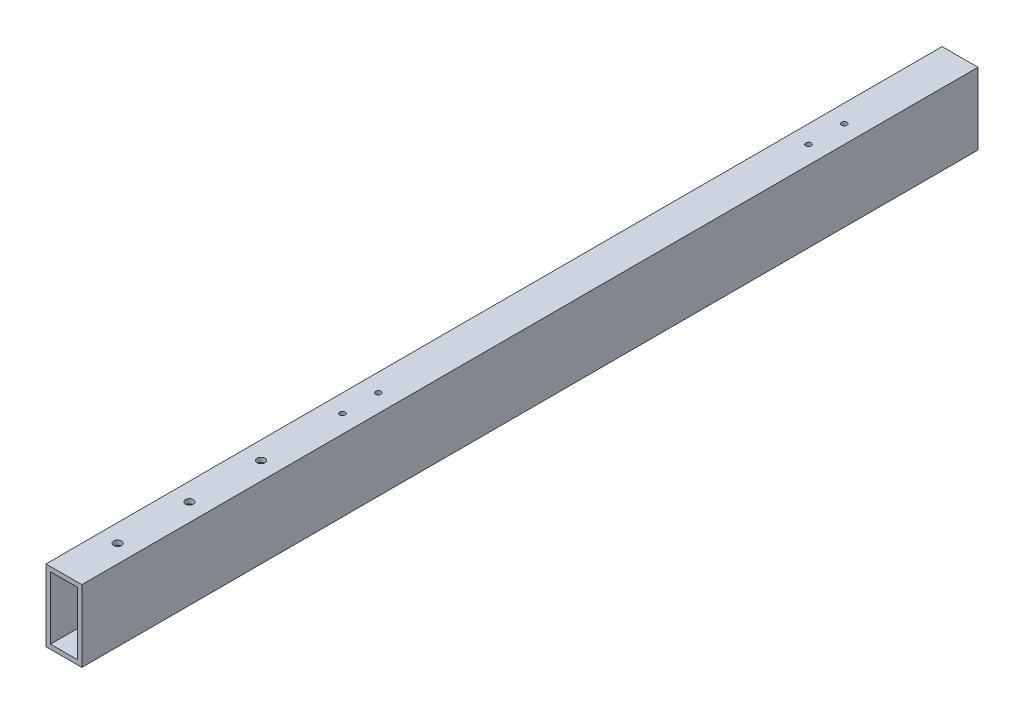
ISO-10303-21;
HEADER;
FILE_DESCRIPTION(('STEP AP214'),'2;1');
FILE_NAME('part.step','',(''),(''),'','','');
FILE_SCHEMA(('AUTOMOTIVE_DESIGN { 1 0 10303 214 1 1 1 1 }'));
ENDSEC;
DATA;
#1=APPLICATION_CONTEXT('core data for automotive mechanical design processes');
#2=APPLICATION_PROTOCOL_DEFINITION('international standard','automotive_design',2000,#1);
#3=PRODUCT_CONTEXT('',#1,'mechanical');
#4=PRODUCT('Part','Part','',(#3));
#5=PRODUCT_RELATED_PRODUCT_CATEGORY('part','',(#4));
#6=PRODUCT_DEFINITION_FORMATION('','',#4);
#7=PRODUCT_DEFINITION_CONTEXT('part definition',#1,'design');
#8=PRODUCT_DEFINITION('design','',#6,#7);
#9=PRODUCT_DEFINITION_SHAPE('','',#8);
#10=(LENGTH_UNIT() NAMED_UNIT(*) SI_UNIT(.MILLI.,.METRE.));
#11=(NAMED_UNIT(*) PLANE_ANGLE_UNIT() SI_UNIT($,.RADIAN.));
#12=(NAMED_UNIT(*) SI_UNIT($,.STERADIAN.) SOLID_ANGLE_UNIT());
#13=UNCERTAINTY_MEASURE_WITH_UNIT(LENGTH_MEASURE(1.E-05),#10,'distance_accuracy_value','');
#14=(GEOMETRIC_REPRESENTATION_CONTEXT(3) GLOBAL_UNCERTAINTY_ASSIGNED_CONTEXT((#13)) GLOBAL_UNIT_ASSIGNED_CONTEXT((#10,
#11,#12)) REPRESENTATION_CONTEXT('',''));
#15=CARTESIAN_POINT('',(0.,0.,0.));
#16=DIRECTION('',(0.,0.,1.));
#17=DIRECTION('',(1.,0.,0.));
#18=AXIS2_PLACEMENT_3D('',#15,#16,#17);
#19=CARTESIAN_POINT('',(0.,0.,317.5));
#20=DIRECTION('',(0.,0.,1.));
#21=DIRECTION('',(1.,0.,0.));
#22=AXIS2_PLACEMENT_3D('',#19,#20,#21);
#23=PLANE('',#22);
#24=DIRECTION('',(0.,1.,0.));
#25=VECTOR('',#24,1.);
#26=CARTESIAN_POINT('',(12.7,25.4,317.5));
#27=LINE('',#26,#25);
#28=CARTESIAN_POINT('',(12.7,-25.4,317.5));
#29=VERTEX_POINT('',#28);
#30=CARTESIAN_POINT('',(12.7,25.4,317.5));
#31=VERTEX_POINT('',#30);
#32=EDGE_CURVE('E140',#29,#31,#27,.T.);
#33=ORIENTED_EDGE('',*,*,#32,.T.);
#34=DIRECTION('',(-1.,0.,0.));
#35=VECTOR('',#34,1.);
#36=CARTESIAN_POINT('',(-12.7,25.4,317.5));
#37=LINE('',#36,#35);
#38=CARTESIAN_POINT('',(-12.7,25.4,317.5));
#39=VERTEX_POINT('',#38);
#40=EDGE_CURVE('E143',#31,#39,#37,.T.);
#41=ORIENTED_EDGE('',*,*,#40,.T.);
#42=DIRECTION('',(0.,-1.,0.));
#43=VECTOR('',#42,1.);
#44=CARTESIAN_POINT('',(-12.7,25.4,317.5));
#45=LINE('',#44,#43);
#46=CARTESIAN_POINT('',(-12.7,-25.4,317.5));
#47=VERTEX_POINT('',#46);
#48=EDGE_CURVE('E146',#39,#47,#45,.T.);
#49=ORIENTED_EDGE('',*,*,#48,.T.);
#50=DIRECTION('',(1.,0.,0.));
#51=VECTOR('',#50,1.);
#52=CARTESIAN_POINT('',(-12.7,-25.4,317.5));
#53=LINE('',#52,#51);
#54=EDGE_CURVE('E148',#47,#29,#53,.T.);
#55=ORIENTED_EDGE('',*,*,#54,.T.);
#56=EDGE_LOOP('',(#33,#41,#49,#55));
#57=FACE_BOUND('',#56,.T.);
#58=DIRECTION('',(1.,0.,0.));
#59=VECTOR('',#58,1.);
#60=CARTESIAN_POINT('',(-9.525,-22.225,317.5));
#61=LINE('',#60,#59);
#62=CARTESIAN_POINT('',(-9.525,-22.225,317.5));
#63=VERTEX_POINT('',#62);
#64=CARTESIAN_POINT('',(9.52500000000001,-22.225,317.5));
#65=VERTEX_POINT('',#64);
#66=EDGE_CURVE('E110',#63,#65,#61,.T.);
#67=ORIENTED_EDGE('',*,*,#66,.F.);
#68=DIRECTION('',(0.,-1.,0.));
#69=VECTOR('',#68,1.);
#70=CARTESIAN_POINT('',(-9.525,22.225,317.5));
#71=LINE('',#70,#69);
#72=CARTESIAN_POINT('',(-9.525,22.225,317.5));
#73=VERTEX_POINT('',#72);
#74=EDGE_CURVE('E102',#73,#63,#71,.T.);
#75=ORIENTED_EDGE('',*,*,#74,.F.);
#76=DIRECTION('',(-1.,0.,0.));
#77=VECTOR('',#76,1.);
#78=CARTESIAN_POINT('',(-9.525,22.225,317.5));
#79=LINE('',#78,#77);
#80=CARTESIAN_POINT('',(9.525,22.225,317.5));
#81=VERTEX_POINT('',#80);
#82=EDGE_CURVE('E124',#81,#73,#79,.T.);
#83=ORIENTED_EDGE('',*,*,#82,.F.);
#84=DIRECTION('',(0.,1.,0.));
#85=VECTOR('',#84,1.);
#86=CARTESIAN_POINT('',(9.525,22.225,317.5));
#87=LINE('',#86,#85);
#88=EDGE_CURVE('E122',#65,#81,#87,.T.);
#89=ORIENTED_EDGE('',*,*,#88,.F.);
#90=EDGE_LOOP('',(#67,#75,#83,#89));
#91=FACE_BOUND('',#90,.T.);
#92=ADVANCED_FACE('F35',(#57,#91),#23,.T.);
#93=CARTESIAN_POINT('',(0.,0.,-317.5));
#94=DIRECTION('',(0.,0.,1.));
#95=DIRECTION('',(1.,0.,0.));
#96=AXIS2_PLACEMENT_3D('',#93,#94,#95);
#97=PLANE('',#96);
#98=DIRECTION('',(0.,1.,0.));
#99=VECTOR('',#98,1.);
#100=CARTESIAN_POINT('',(12.7,25.4,-317.5));
#101=LINE('',#100,#99);
#102=CARTESIAN_POINT('',(12.7,-25.4,-317.5));
#103=VERTEX_POINT('',#102);
#104=CARTESIAN_POINT('',(12.7,25.4,-317.5));
#105=VERTEX_POINT('',#104);
#106=EDGE_CURVE('E118',#103,#105,#101,.T.);
#107=ORIENTED_EDGE('',*,*,#106,.F.);
#108=DIRECTION('',(1.,0.,0.));
#109=VECTOR('',#108,1.);
#110=CARTESIAN_POINT('',(-12.7,-25.4,-317.5));
#111=LINE('',#110,#109);
#112=CARTESIAN_POINT('',(-12.7,-25.4,-317.5));
#113=VERTEX_POINT('',#112);
#114=EDGE_CURVE('E144',#113,#103,#111,.T.);
#115=ORIENTED_EDGE('',*,*,#114,.F.);
#116=DIRECTION('',(0.,-1.,0.));
#117=VECTOR('',#116,1.);
#118=CARTESIAN_POINT('',(-12.7,25.4,-317.5));
#119=LINE('',#118,#117);
#120=CARTESIAN_POINT('',(-12.7,25.4,-317.5));
#121=VERTEX_POINT('',#120);
#122=EDGE_CURVE('E155',#121,#113,#119,.T.);
#123=ORIENTED_EDGE('',*,*,#122,.F.);
#124=DIRECTION('',(-1.,0.,0.));
#125=VECTOR('',#124,1.);
#126=CARTESIAN_POINT('',(-12.7,25.4,-317.5));
#127=LINE('',#126,#125);
#128=EDGE_CURVE('E153',#105,#121,#127,.T.);
#129=ORIENTED_EDGE('',*,*,#128,.F.);
#130=EDGE_LOOP('',(#107,#115,#123,#129));
#131=FACE_BOUND('',#130,.T.);
#132=DIRECTION('',(0.,-1.,0.));
#133=VECTOR('',#132,1.);
#134=CARTESIAN_POINT('',(-9.525,22.225,-317.5));
#135=LINE('',#134,#133);
#136=CARTESIAN_POINT('',(-9.525,22.225,-317.5));
#137=VERTEX_POINT('',#136);
#138=CARTESIAN_POINT('',(-9.525,-22.225,-317.5));
#139=VERTEX_POINT('',#138);
#140=EDGE_CURVE('E60',#137,#139,#135,.T.);
#141=ORIENTED_EDGE('',*,*,#140,.T.);
#142=DIRECTION('',(1.,0.,0.));
#143=VECTOR('',#142,1.);
#144=CARTESIAN_POINT('',(-9.525,-22.225,-317.5));
#145=LINE('',#144,#143);
#146=CARTESIAN_POINT('',(9.52500000000001,-22.225,-317.5));
#147=VERTEX_POINT('',#146);
#148=EDGE_CURVE('E117',#139,#147,#145,.T.);
#149=ORIENTED_EDGE('',*,*,#148,.T.);
#150=DIRECTION('',(0.,1.,0.));
#151=VECTOR('',#150,1.);
#152=CARTESIAN_POINT('',(9.525,22.225,-317.5));
#153=LINE('',#152,#151);
#154=CARTESIAN_POINT('',(9.525,22.225,-317.5));
#155=VERTEX_POINT('',#154);
#156=EDGE_CURVE('E132',#147,#155,#153,.T.);
#157=ORIENTED_EDGE('',*,*,#156,.T.);
#158=DIRECTION('',(-1.,0.,0.));
#159=VECTOR('',#158,1.);
#160=CARTESIAN_POINT('',(-9.525,22.225,-317.5));
#161=LINE('',#160,#159);
#162=EDGE_CURVE('E111',#155,#137,#161,.T.);
#163=ORIENTED_EDGE('',*,*,#162,.T.);
#164=EDGE_LOOP('',(#141,#149,#157,#163));
#165=FACE_BOUND('',#164,.T.);
#166=ADVANCED_FACE('F255',(#131,#165),#97,.F.);
#167=CARTESIAN_POINT('',(12.7,25.4,317.5));
#168=DIRECTION('',(-1.,0.,0.));
#169=DIRECTION('',(0.,-1.,0.));
#170=AXIS2_PLACEMENT_3D('',#167,#168,#169);
#171=PLANE('',#170);
#172=ORIENTED_EDGE('',*,*,#106,.T.);
#173=DIRECTION('',(0.,0.,-1.));
#174=VECTOR('',#173,1.);
#175=CARTESIAN_POINT('',(12.7,25.4,317.5));
#176=LINE('',#175,#174);
#177=EDGE_CURVE('E11',#31,#105,#176,.T.);
#178=ORIENTED_EDGE('',*,*,#177,.F.);
#179=ORIENTED_EDGE('',*,*,#32,.F.);
#180=DIRECTION('',(0.,0.,-1.));
#181=VECTOR('',#180,1.);
#182=CARTESIAN_POINT('',(12.7,-25.4,317.5));
#183=LINE('',#182,#181);
#184=EDGE_CURVE('E150',#29,#103,#183,.T.);
#185=ORIENTED_EDGE('',*,*,#184,.T.);
#186=EDGE_LOOP('',(#172,#178,#179,#185));
#187=FACE_BOUND('',#186,.T.);
#188=ADVANCED_FACE('F37',(#187),#171,.F.);
#189=CARTESIAN_POINT('',(-12.7,25.4,317.5));
#190=DIRECTION('',(0.,-1.,0.));
#191=DIRECTION('',(0.,0.,-1.));
#192=AXIS2_PLACEMENT_3D('',#189,#190,#191);
#193=PLANE('',#192);
#194=CARTESIAN_POINT('',(2.04003480774873E-12,25.4,279.399917535532));
#195=DIRECTION('',(0.,1.,0.));
#196=DIRECTION('',(0.,0.,1.));
#197=AXIS2_PLACEMENT_3D('',#194,#195,#196);
#198=CIRCLE('',#197,2.80670000004883);
#199=CARTESIAN_POINT('',(2.04003480774873E-12,25.4,282.206617535581));
#200=VERTEX_POINT('',#199);
#201=EDGE_CURVE('E280',#200,#200,#198,.T.);
#202=ORIENTED_EDGE('',*,*,#201,.F.);
#203=EDGE_LOOP('',(#202));
#204=FACE_BOUND('',#203,.T.);
#205=CARTESIAN_POINT('',(2.02615701994091E-12,25.4,228.599917535532));
#206=DIRECTION('',(0.,1.,0.));
#207=DIRECTION('',(0.,0.,1.));
#208=AXIS2_PLACEMENT_3D('',#205,#206,#207);
#209=CIRCLE('',#208,2.80670000004884);
#210=CARTESIAN_POINT('',(2.02615701994091E-12,25.4,231.406617535581));
#211=VERTEX_POINT('',#210);
#212=EDGE_CURVE('E200',#211,#211,#209,.T.);
#213=ORIENTED_EDGE('',*,*,#212,.F.);
#214=EDGE_LOOP('',(#213));
#215=FACE_BOUND('',#214,.T.);
#216=CARTESIAN_POINT('',(9.06774655362597E-11,25.4,177.799917535655));
#217=DIRECTION('',(0.,1.,0.));
#218=DIRECTION('',(0.,0.,1.));
#219=AXIS2_PLACEMENT_3D('',#216,#217,#218);
#220=CIRCLE('',#219,2.8067);
#221=CARTESIAN_POINT('',(9.06774655362597E-11,25.4,180.606617535655));
#222=VERTEX_POINT('',#221);
#223=EDGE_CURVE('E287',#222,#222,#220,.T.);
#224=ORIENTED_EDGE('',*,*,#223,.F.);
#225=EDGE_LOOP('',(#224));
#226=FACE_BOUND('',#225,.T.);
#227=CARTESIAN_POINT('',(0.,25.4,-210.08594));
#228=DIRECTION('',(0.,1.,0.));
#229=DIRECTION('',(0.,0.,1.));
#230=AXIS2_PLACEMENT_3D('',#227,#228,#229);
#231=CIRCLE('',#230,1.905);
#232=CARTESIAN_POINT('',(0.,25.4,-208.18094));
#233=VERTEX_POINT('',#232);
#234=EDGE_CURVE('E206',#233,#233,#231,.T.);
#235=ORIENTED_EDGE('',*,*,#234,.F.);
#236=EDGE_LOOP('',(#235));
#237=FACE_BOUND('',#236,.T.);
#238=CARTESIAN_POINT('',(0.,25.4,-235.48594));
#239=DIRECTION('',(0.,1.,0.));
#240=DIRECTION('',(0.,0.,1.));
#241=AXIS2_PLACEMENT_3D('',#238,#239,#240);
#242=CIRCLE('',#241,1.905);
#243=CARTESIAN_POINT('',(0.,25.4,-233.58094));
#244=VERTEX_POINT('',#243);
#245=EDGE_CURVE('E213',#244,#244,#242,.T.);
#246=ORIENTED_EDGE('',*,*,#245,.F.);
#247=EDGE_LOOP('',(#246));
#248=FACE_BOUND('',#247,.T.);
#249=CARTESIAN_POINT('',(0.,25.4,94.7166));
#250=DIRECTION('',(0.,1.,0.));
#251=DIRECTION('',(0.,0.,1.));
#252=AXIS2_PLACEMENT_3D('',#249,#250,#251);
#253=CIRCLE('',#252,1.905);
#254=CARTESIAN_POINT('',(0.,25.4,96.6216));
#255=VERTEX_POINT('',#254);
#256=EDGE_CURVE('E220',#255,#255,#253,.T.);
#257=ORIENTED_EDGE('',*,*,#256,.F.);
#258=EDGE_LOOP('',(#257));
#259=FACE_BOUND('',#258,.T.);
#260=CARTESIAN_POINT('',(0.,25.4,120.1166));
#261=DIRECTION('',(0.,1.,0.));
#262=DIRECTION('',(0.,0.,1.));
#263=AXIS2_PLACEMENT_3D('',#260,#261,#262);
#264=CIRCLE('',#263,1.905);
#265=CARTESIAN_POINT('',(0.,25.4,122.0216));
#266=VERTEX_POINT('',#265);
#267=EDGE_CURVE('E227',#266,#266,#264,.T.);
#268=ORIENTED_EDGE('',*,*,#267,.F.);
#269=EDGE_LOOP('',(#268));
#270=FACE_BOUND('',#269,.T.);
#271=ORIENTED_EDGE('',*,*,#128,.T.);
#272=DIRECTION('',(0.,0.,-1.));
#273=VECTOR('',#272,1.);
#274=CARTESIAN_POINT('',(-12.7,25.4,317.5));
#275=LINE('',#274,#273);
#276=EDGE_CURVE('E44',#39,#121,#275,.T.);
#277=ORIENTED_EDGE('',*,*,#276,.F.);
#278=ORIENTED_EDGE('',*,*,#40,.F.);
#279=ORIENTED_EDGE('',*,*,#177,.T.);
#280=EDGE_LOOP('',(#271,#277,#278,#279));
#281=FACE_BOUND('',#280,.T.);
#282=ADVANCED_FACE('F268',(#204,#215,#226,#237,#248,#259,#270,#281),#193,.F.);
#283=CARTESIAN_POINT('',(-12.7,25.4,317.5));
#284=DIRECTION('',(1.,0.,0.));
#285=DIRECTION('',(0.,1.,0.));
#286=AXIS2_PLACEMENT_3D('',#283,#284,#285);
#287=PLANE('',#286);
#288=ORIENTED_EDGE('',*,*,#122,.T.);
#289=DIRECTION('',(0.,0.,-1.));
#290=VECTOR('',#289,1.);
#291=CARTESIAN_POINT('',(-12.7,-25.4,317.5));
#292=LINE('',#291,#290);
#293=EDGE_CURVE('E160',#47,#113,#292,.T.);
#294=ORIENTED_EDGE('',*,*,#293,.F.);
#295=ORIENTED_EDGE('',*,*,#48,.F.);
#296=ORIENTED_EDGE('',*,*,#276,.T.);
#297=EDGE_LOOP('',(#288,#294,#295,#296));
#298=FACE_BOUND('',#297,.T.);
#299=ADVANCED_FACE('F265',(#298),#287,.F.);
#300=CARTESIAN_POINT('',(-12.7,-25.4,317.5));
#301=DIRECTION('',(0.,1.,0.));
#302=DIRECTION('',(0.,0.,1.));
#303=AXIS2_PLACEMENT_3D('',#300,#301,#302);
#304=PLANE('',#303);
#305=CARTESIAN_POINT('',(2.04003480774873E-12,-25.4,279.399917535532));
#306=DIRECTION('',(0.,1.,0.));
#307=DIRECTION('',(0.,0.,1.));
#308=AXIS2_PLACEMENT_3D('',#305,#306,#307);
#309=CIRCLE('',#308,2.80670000004883);
#310=CARTESIAN_POINT('',(2.04003480774873E-12,-25.4,282.206617535581));
#311=VERTEX_POINT('',#310);
#312=EDGE_CURVE('E187',#311,#311,#309,.T.);
#313=ORIENTED_EDGE('',*,*,#312,.T.);
#314=EDGE_LOOP('',(#313));
#315=FACE_BOUND('',#314,.T.);
#316=CARTESIAN_POINT('',(2.02615701994091E-12,-25.4,228.599917535532));
#317=DIRECTION('',(0.,1.,0.));
#318=DIRECTION('',(0.,0.,1.));
#319=AXIS2_PLACEMENT_3D('',#316,#317,#318);
#320=CIRCLE('',#319,2.80670000004884);
#321=CARTESIAN_POINT('',(2.02615701994091E-12,-25.4,231.406617535581));
#322=VERTEX_POINT('',#321);
#323=EDGE_CURVE('E364',#322,#322,#320,.T.);
#324=ORIENTED_EDGE('',*,*,#323,.T.);
#325=EDGE_LOOP('',(#324));
#326=FACE_BOUND('',#325,.T.);
#327=CARTESIAN_POINT('',(9.06774655362597E-11,-25.4,177.799917535655));
#328=DIRECTION('',(0.,1.,0.));
#329=DIRECTION('',(0.,0.,1.));
#330=AXIS2_PLACEMENT_3D('',#327,#328,#329);
#331=CIRCLE('',#330,2.8067);
#332=CARTESIAN_POINT('',(9.06774655362597E-11,-25.4,180.606617535655));
#333=VERTEX_POINT('',#332);
#334=EDGE_CURVE('E361',#333,#333,#331,.T.);
#335=ORIENTED_EDGE('',*,*,#334,.T.);
#336=EDGE_LOOP('',(#335));
#337=FACE_BOUND('',#336,.T.);
#338=CARTESIAN_POINT('',(0.,-25.4,-210.08594));
#339=DIRECTION('',(0.,1.,0.));
#340=DIRECTION('',(0.,0.,1.));
#341=AXIS2_PLACEMENT_3D('',#338,#339,#340);
#342=CIRCLE('',#341,1.905);
#343=CARTESIAN_POINT('',(0.,-25.4,-208.18094));
#344=VERTEX_POINT('',#343);
#345=EDGE_CURVE('E183',#344,#344,#342,.T.);
#346=ORIENTED_EDGE('',*,*,#345,.T.);
#347=EDGE_LOOP('',(#346));
#348=FACE_BOUND('',#347,.T.);
#349=CARTESIAN_POINT('',(0.,-25.4,-235.48594));
#350=DIRECTION('',(0.,1.,0.));
#351=DIRECTION('',(0.,0.,1.));
#352=AXIS2_PLACEMENT_3D('',#349,#350,#351);
#353=CIRCLE('',#352,1.905);
#354=CARTESIAN_POINT('',(0.,-25.4,-233.58094));
#355=VERTEX_POINT('',#354);
#356=EDGE_CURVE('E178',#355,#355,#353,.T.);
#357=ORIENTED_EDGE('',*,*,#356,.T.);
#358=EDGE_LOOP('',(#357));
#359=FACE_BOUND('',#358,.T.);
#360=CARTESIAN_POINT('',(0.,-25.4,94.7166));
#361=DIRECTION('',(0.,1.,0.));
#362=DIRECTION('',(0.,0.,1.));
#363=AXIS2_PLACEMENT_3D('',#360,#361,#362);
#364=CIRCLE('',#363,1.905);
#365=CARTESIAN_POINT('',(0.,-25.4,96.6216));
#366=VERTEX_POINT('',#365);
#367=EDGE_CURVE('E173',#366,#366,#364,.T.);
#368=ORIENTED_EDGE('',*,*,#367,.T.);
#369=EDGE_LOOP('',(#368));
#370=FACE_BOUND('',#369,.T.);
#371=CARTESIAN_POINT('',(0.,-25.4,120.1166));
#372=DIRECTION('',(0.,1.,0.));
#373=DIRECTION('',(0.,0.,1.));
#374=AXIS2_PLACEMENT_3D('',#371,#372,#373);
#375=CIRCLE('',#374,1.905);
#376=CARTESIAN_POINT('',(0.,-25.4,122.0216));
#377=VERTEX_POINT('',#376);
#378=EDGE_CURVE('E168',#377,#377,#375,.T.);
#379=ORIENTED_EDGE('',*,*,#378,.T.);
#380=EDGE_LOOP('',(#379));
#381=FACE_BOUND('',#380,.T.);
#382=ORIENTED_EDGE('',*,*,#114,.T.);
#383=ORIENTED_EDGE('',*,*,#184,.F.);
#384=ORIENTED_EDGE('',*,*,#54,.F.);
#385=ORIENTED_EDGE('',*,*,#293,.T.);
#386=EDGE_LOOP('',(#382,#383,#384,#385));
#387=FACE_BOUND('',#386,.T.);
#388=ADVANCED_FACE('F250',(#315,#326,#337,#348,#359,#370,#381,#387),#304,.F.);
#389=CARTESIAN_POINT('',(-9.525,22.225,317.5));
#390=DIRECTION('',(1.,0.,0.));
#391=DIRECTION('',(0.,1.,0.));
#392=AXIS2_PLACEMENT_3D('',#389,#390,#391);
#393=PLANE('',#392);
#394=ORIENTED_EDGE('',*,*,#140,.F.);
#395=DIRECTION('',(0.,0.,-1.));
#396=VECTOR('',#395,1.);
#397=CARTESIAN_POINT('',(-9.525,22.225,317.5));
#398=LINE('',#397,#396);
#399=EDGE_CURVE('E106',#73,#137,#398,.T.);
#400=ORIENTED_EDGE('',*,*,#399,.F.);
#401=ORIENTED_EDGE('',*,*,#74,.T.);
#402=DIRECTION('',(0.,0.,-1.));
#403=VECTOR('',#402,1.);
#404=CARTESIAN_POINT('',(-9.525,-22.225,317.5));
#405=LINE('',#404,#403);
#406=EDGE_CURVE('E105',#63,#139,#405,.T.);
#407=ORIENTED_EDGE('',*,*,#406,.T.);
#408=EDGE_LOOP('',(#394,#400,#401,#407));
#409=FACE_BOUND('',#408,.T.);
#410=ADVANCED_FACE('F104',(#409),#393,.T.);
#411=CARTESIAN_POINT('',(-9.525,-22.225,317.5));
#412=DIRECTION('',(0.,1.,0.));
#413=DIRECTION('',(-1.,0.,0.));
#414=AXIS2_PLACEMENT_3D('',#411,#412,#413);
#415=PLANE('',#414);
#416=CARTESIAN_POINT('',(2.04003480774873E-12,-22.225,279.399917535532));
#417=DIRECTION('',(0.,1.,0.));
#418=DIRECTION('',(-1.,0.,0.));
#419=AXIS2_PLACEMENT_3D('',#416,#417,#418);
#420=CIRCLE('',#419,2.80670000004883);
#421=CARTESIAN_POINT('',(-2.80670000004679,-22.225,279.399917535532));
#422=VERTEX_POINT('',#421);
#423=EDGE_CURVE('E203',#422,#422,#420,.T.);
#424=ORIENTED_EDGE('',*,*,#423,.F.);
#425=EDGE_LOOP('',(#424));
#426=FACE_BOUND('',#425,.T.);
#427=CARTESIAN_POINT('',(2.02615701994091E-12,-22.225,228.599917535532));
#428=DIRECTION('',(0.,1.,0.));
#429=DIRECTION('',(-1.,0.,0.));
#430=AXIS2_PLACEMENT_3D('',#427,#428,#429);
#431=CIRCLE('',#430,2.80670000004884);
#432=CARTESIAN_POINT('',(-2.80670000004681,-22.225,228.599917535532));
#433=VERTEX_POINT('',#432);
#434=EDGE_CURVE('E190',#433,#433,#431,.T.);
#435=ORIENTED_EDGE('',*,*,#434,.F.);
#436=EDGE_LOOP('',(#435));
#437=FACE_BOUND('',#436,.T.);
#438=CARTESIAN_POINT('',(9.06774655362597E-11,-22.225,177.799917535655));
#439=DIRECTION('',(0.,1.,0.));
#440=DIRECTION('',(-1.,0.,0.));
#441=AXIS2_PLACEMENT_3D('',#438,#439,#440);
#442=CIRCLE('',#441,2.8067);
#443=CARTESIAN_POINT('',(-2.80669999990932,-22.225,177.799917535655));
#444=VERTEX_POINT('',#443);
#445=EDGE_CURVE('E186',#444,#444,#442,.T.);
#446=ORIENTED_EDGE('',*,*,#445,.F.);
#447=EDGE_LOOP('',(#446));
#448=FACE_BOUND('',#447,.T.);
#449=CARTESIAN_POINT('',(0.,-22.225,-210.08594));
#450=DIRECTION('',(0.,1.,0.));
#451=DIRECTION('',(-1.,0.,0.));
#452=AXIS2_PLACEMENT_3D('',#449,#450,#451);
#453=CIRCLE('',#452,1.905);
#454=CARTESIAN_POINT('',(-1.905,-22.225,-210.08594));
#455=VERTEX_POINT('',#454);
#456=EDGE_CURVE('E182',#455,#455,#453,.T.);
#457=ORIENTED_EDGE('',*,*,#456,.F.);
#458=EDGE_LOOP('',(#457));
#459=FACE_BOUND('',#458,.T.);
#460=CARTESIAN_POINT('',(0.,-22.225,-235.48594));
#461=DIRECTION('',(0.,1.,0.));
#462=DIRECTION('',(-1.,0.,0.));
#463=AXIS2_PLACEMENT_3D('',#460,#461,#462);
#464=CIRCLE('',#463,1.905);
#465=CARTESIAN_POINT('',(-1.905,-22.225,-235.48594));
#466=VERTEX_POINT('',#465);
#467=EDGE_CURVE('E177',#466,#466,#464,.T.);
#468=ORIENTED_EDGE('',*,*,#467,.F.);
#469=EDGE_LOOP('',(#468));
#470=FACE_BOUND('',#469,.T.);
#471=CARTESIAN_POINT('',(0.,-22.225,94.7166));
#472=DIRECTION('',(0.,1.,0.));
#473=DIRECTION('',(-1.,0.,0.));
#474=AXIS2_PLACEMENT_3D('',#471,#472,#473);
#475=CIRCLE('',#474,1.905);
#476=CARTESIAN_POINT('',(-1.905,-22.225,94.7166));
#477=VERTEX_POINT('',#476);
#478=EDGE_CURVE('E172',#477,#477,#475,.T.);
#479=ORIENTED_EDGE('',*,*,#478,.F.);
#480=EDGE_LOOP('',(#479));
#481=FACE_BOUND('',#480,.T.);
#482=CARTESIAN_POINT('',(0.,-22.225,120.1166));
#483=DIRECTION('',(0.,1.,0.));
#484=DIRECTION('',(-1.,0.,0.));
#485=AXIS2_PLACEMENT_3D('',#482,#483,#484);
#486=CIRCLE('',#485,1.905);
#487=CARTESIAN_POINT('',(-1.905,-22.225,120.1166));
#488=VERTEX_POINT('',#487);
#489=EDGE_CURVE('E130',#488,#488,#486,.T.);
#490=ORIENTED_EDGE('',*,*,#489,.F.);
#491=EDGE_LOOP('',(#490));
#492=FACE_BOUND('',#491,.T.);
#493=ORIENTED_EDGE('',*,*,#148,.F.);
#494=ORIENTED_EDGE('',*,*,#406,.F.);
#495=ORIENTED_EDGE('',*,*,#66,.T.);
#496=DIRECTION('',(0.,0.,-1.));
#497=VECTOR('',#496,1.);
#498=CARTESIAN_POINT('',(9.52500000000001,-22.225,317.5));
#499=LINE('',#498,#497);
#500=EDGE_CURVE('E119',#65,#147,#499,.T.);
#501=ORIENTED_EDGE('',*,*,#500,.T.);
#502=EDGE_LOOP('',(#493,#494,#495,#501));
#503=FACE_BOUND('',#502,.T.);
#504=ADVANCED_FACE('F114',(#426,#437,#448,#459,#470,#481,#492,#503),#415,.T.);
#505=CARTESIAN_POINT('',(9.525,22.225,317.5));
#506=DIRECTION('',(-1.,0.,0.));
#507=DIRECTION('',(0.,-1.,0.));
#508=AXIS2_PLACEMENT_3D('',#505,#506,#507);
#509=PLANE('',#508);
#510=ORIENTED_EDGE('',*,*,#156,.F.);
#511=ORIENTED_EDGE('',*,*,#500,.F.);
#512=ORIENTED_EDGE('',*,*,#88,.T.);
#513=DIRECTION('',(0.,0.,-1.));
#514=VECTOR('',#513,1.);
#515=CARTESIAN_POINT('',(9.525,22.225,317.5));
#516=LINE('',#515,#514);
#517=EDGE_CURVE('E52',#81,#155,#516,.T.);
#518=ORIENTED_EDGE('',*,*,#517,.T.);
#519=EDGE_LOOP('',(#510,#511,#512,#518));
#520=FACE_BOUND('',#519,.T.);
#521=ADVANCED_FACE('F238',(#520),#509,.T.);
#522=CARTESIAN_POINT('',(-9.525,22.225,317.5));
#523=DIRECTION('',(0.,-1.,0.));
#524=DIRECTION('',(0.,0.,-1.));
#525=AXIS2_PLACEMENT_3D('',#522,#523,#524);
#526=PLANE('',#525);
#527=CARTESIAN_POINT('',(2.04003480774873E-12,22.225,279.399917535532));
#528=DIRECTION('',(0.,-1.,0.));
#529=DIRECTION('',(0.,0.,-1.));
#530=AXIS2_PLACEMENT_3D('',#527,#528,#529);
#531=CIRCLE('',#530,2.80670000004883);
#532=CARTESIAN_POINT('',(2.04003480774873E-12,22.225,276.593217535483));
#533=VERTEX_POINT('',#532);
#534=EDGE_CURVE('E39',#533,#533,#531,.T.);
#535=ORIENTED_EDGE('',*,*,#534,.F.);
#536=EDGE_LOOP('',(#535));
#537=FACE_BOUND('',#536,.T.);
#538=CARTESIAN_POINT('',(2.02615701994091E-12,22.225,228.599917535532));
#539=DIRECTION('',(0.,-1.,0.));
#540=DIRECTION('',(0.,0.,-1.));
#541=AXIS2_PLACEMENT_3D('',#538,#539,#540);
#542=CIRCLE('',#541,2.80670000004884);
#543=CARTESIAN_POINT('',(2.02615701994091E-12,22.225,225.793217535483));
#544=VERTEX_POINT('',#543);
#545=EDGE_CURVE('E188',#544,#544,#542,.T.);
#546=ORIENTED_EDGE('',*,*,#545,.F.);
#547=EDGE_LOOP('',(#546));
#548=FACE_BOUND('',#547,.T.);
#549=CARTESIAN_POINT('',(9.06774655362597E-11,22.225,177.799917535655));
#550=DIRECTION('',(0.,-1.,0.));
#551=DIRECTION('',(0.,0.,-1.));
#552=AXIS2_PLACEMENT_3D('',#549,#550,#551);
#553=CIRCLE('',#552,2.8067);
#554=CARTESIAN_POINT('',(9.06774655362597E-11,22.225,174.993217535655));
#555=VERTEX_POINT('',#554);
#556=EDGE_CURVE('E184',#555,#555,#553,.T.);
#557=ORIENTED_EDGE('',*,*,#556,.F.);
#558=EDGE_LOOP('',(#557));
#559=FACE_BOUND('',#558,.T.);
#560=CARTESIAN_POINT('',(0.,22.225,-210.08594));
#561=DIRECTION('',(0.,-1.,0.));
#562=DIRECTION('',(0.,0.,-1.));
#563=AXIS2_PLACEMENT_3D('',#560,#561,#562);
#564=CIRCLE('',#563,1.905);
#565=CARTESIAN_POINT('',(0.,22.225,-211.99094));
#566=VERTEX_POINT('',#565);
#567=EDGE_CURVE('E179',#566,#566,#564,.T.);
#568=ORIENTED_EDGE('',*,*,#567,.F.);
#569=EDGE_LOOP('',(#568));
#570=FACE_BOUND('',#569,.T.);
#571=CARTESIAN_POINT('',(0.,22.225,-235.48594));
#572=DIRECTION('',(0.,-1.,0.));
#573=DIRECTION('',(0.,0.,-1.));
#574=AXIS2_PLACEMENT_3D('',#571,#572,#573);
#575=CIRCLE('',#574,1.905);
#576=CARTESIAN_POINT('',(0.,22.225,-237.39094));
#577=VERTEX_POINT('',#576);
#578=EDGE_CURVE('E174',#577,#577,#575,.T.);
#579=ORIENTED_EDGE('',*,*,#578,.F.);
#580=EDGE_LOOP('',(#579));
#581=FACE_BOUND('',#580,.T.);
#582=CARTESIAN_POINT('',(0.,22.225,94.7166));
#583=DIRECTION('',(0.,-1.,0.));
#584=DIRECTION('',(0.,0.,-1.));
#585=AXIS2_PLACEMENT_3D('',#582,#583,#584);
#586=CIRCLE('',#585,1.905);
#587=CARTESIAN_POINT('',(0.,22.225,92.8116));
#588=VERTEX_POINT('',#587);
#589=EDGE_CURVE('E169',#588,#588,#586,.T.);
#590=ORIENTED_EDGE('',*,*,#589,.F.);
#591=EDGE_LOOP('',(#590));
#592=FACE_BOUND('',#591,.T.);
#593=CARTESIAN_POINT('',(0.,22.225,120.1166));
#594=DIRECTION('',(0.,-1.,0.));
#595=DIRECTION('',(0.,0.,-1.));
#596=AXIS2_PLACEMENT_3D('',#593,#594,#595);
#597=CIRCLE('',#596,1.905);
#598=CARTESIAN_POINT('',(0.,22.225,118.2116));
#599=VERTEX_POINT('',#598);
#600=EDGE_CURVE('E165',#599,#599,#597,.T.);
#601=ORIENTED_EDGE('',*,*,#600,.F.);
#602=EDGE_LOOP('',(#601));
#603=FACE_BOUND('',#602,.T.);
#604=ORIENTED_EDGE('',*,*,#162,.F.);
#605=ORIENTED_EDGE('',*,*,#517,.F.);
#606=ORIENTED_EDGE('',*,*,#82,.T.);
#607=ORIENTED_EDGE('',*,*,#399,.T.);
#608=EDGE_LOOP('',(#604,#605,#606,#607));
#609=FACE_BOUND('',#608,.T.);
#610=ADVANCED_FACE('F246',(#537,#548,#559,#570,#581,#592,#603,#609),#526,.T.);
#611=CARTESIAN_POINT('',(0.,-25.4,120.1166));
#612=DIRECTION('',(0.,1.,0.));
#613=DIRECTION('',(0.,0.,1.));
#614=AXIS2_PLACEMENT_3D('',#611,#612,#613);
#615=CYLINDRICAL_SURFACE('',#614,1.905);
#616=ORIENTED_EDGE('',*,*,#600,.T.);
#617=EDGE_LOOP('',(#616));
#618=FACE_BOUND('',#617,.T.);
#619=ORIENTED_EDGE('',*,*,#267,.T.);
#620=EDGE_LOOP('',(#619));
#621=FACE_BOUND('',#620,.T.);
#622=ADVANCED_FACE('F309',(#618,#621),#615,.F.);
#623=ORIENTED_EDGE('',*,*,#489,.T.);
#624=EDGE_LOOP('',(#623));
#625=FACE_BOUND('',#624,.T.);
#626=ORIENTED_EDGE('',*,*,#378,.F.);
#627=EDGE_LOOP('',(#626));
#628=FACE_BOUND('',#627,.T.);
#629=ADVANCED_FACE('F234',(#625,#628),#615,.F.);
#630=CARTESIAN_POINT('',(0.,-25.4,94.7166));
#631=DIRECTION('',(0.,1.,0.));
#632=DIRECTION('',(0.,0.,1.));
#633=AXIS2_PLACEMENT_3D('',#630,#631,#632);
#634=CYLINDRICAL_SURFACE('',#633,1.905);
#635=ORIENTED_EDGE('',*,*,#589,.T.);
#636=EDGE_LOOP('',(#635));
#637=FACE_BOUND('',#636,.T.);
#638=ORIENTED_EDGE('',*,*,#256,.T.);
#639=EDGE_LOOP('',(#638));
#640=FACE_BOUND('',#639,.T.);
#641=ADVANCED_FACE('F321',(#637,#640),#634,.F.);
#642=ORIENTED_EDGE('',*,*,#478,.T.);
#643=EDGE_LOOP('',(#642));
#644=FACE_BOUND('',#643,.T.);
#645=ORIENTED_EDGE('',*,*,#367,.F.);
#646=EDGE_LOOP('',(#645));
#647=FACE_BOUND('',#646,.T.);
#648=ADVANCED_FACE('F324',(#644,#647),#634,.F.);
#649=CARTESIAN_POINT('',(0.,-25.4,-235.48594));
#650=DIRECTION('',(0.,1.,0.));
#651=DIRECTION('',(0.,0.,1.));
#652=AXIS2_PLACEMENT_3D('',#649,#650,#651);
#653=CYLINDRICAL_SURFACE('',#652,1.905);
#654=ORIENTED_EDGE('',*,*,#578,.T.);
#655=EDGE_LOOP('',(#654));
#656=FACE_BOUND('',#655,.T.);
#657=ORIENTED_EDGE('',*,*,#245,.T.);
#658=EDGE_LOOP('',(#657));
#659=FACE_BOUND('',#658,.T.);
#660=ADVANCED_FACE('F326',(#656,#659),#653,.F.);
#661=ORIENTED_EDGE('',*,*,#467,.T.);
#662=EDGE_LOOP('',(#661));
#663=FACE_BOUND('',#662,.T.);
#664=ORIENTED_EDGE('',*,*,#356,.F.);
#665=EDGE_LOOP('',(#664));
#666=FACE_BOUND('',#665,.T.);
#667=ADVANCED_FACE('F329',(#663,#666),#653,.F.);
#668=CARTESIAN_POINT('',(0.,-25.4,-210.08594));
#669=DIRECTION('',(0.,1.,0.));
#670=DIRECTION('',(0.,0.,1.));
#671=AXIS2_PLACEMENT_3D('',#668,#669,#670);
#672=CYLINDRICAL_SURFACE('',#671,1.905);
#673=ORIENTED_EDGE('',*,*,#567,.T.);
#674=EDGE_LOOP('',(#673));
#675=FACE_BOUND('',#674,.T.);
#676=ORIENTED_EDGE('',*,*,#234,.T.);
#677=EDGE_LOOP('',(#676));
#678=FACE_BOUND('',#677,.T.);
#679=ADVANCED_FACE('F331',(#675,#678),#672,.F.);
#680=ORIENTED_EDGE('',*,*,#456,.T.);
#681=EDGE_LOOP('',(#680));
#682=FACE_BOUND('',#681,.T.);
#683=ORIENTED_EDGE('',*,*,#345,.F.);
#684=EDGE_LOOP('',(#683));
#685=FACE_BOUND('',#684,.T.);
#686=ADVANCED_FACE('F334',(#682,#685),#672,.F.);
#687=CARTESIAN_POINT('',(9.06774655362597E-11,-25.4,177.799917535655));
#688=DIRECTION('',(0.,1.,0.));
#689=DIRECTION('',(0.,0.,1.));
#690=AXIS2_PLACEMENT_3D('',#687,#688,#689);
#691=CYLINDRICAL_SURFACE('',#690,2.8067);
#692=ORIENTED_EDGE('',*,*,#556,.T.);
#693=EDGE_LOOP('',(#692));
#694=FACE_BOUND('',#693,.T.);
#695=ORIENTED_EDGE('',*,*,#223,.T.);
#696=EDGE_LOOP('',(#695));
#697=FACE_BOUND('',#696,.T.);
#698=ADVANCED_FACE('F340',(#694,#697),#691,.F.);
#699=CARTESIAN_POINT('',(2.02615701994091E-12,-25.4,228.599917535532));
#700=DIRECTION('',(0.,1.,0.));
#701=DIRECTION('',(0.,0.,1.));
#702=AXIS2_PLACEMENT_3D('',#699,#700,#701);
#703=CYLINDRICAL_SURFACE('',#702,2.80670000004884);
#704=ORIENTED_EDGE('',*,*,#545,.T.);
#705=EDGE_LOOP('',(#704));
#706=FACE_BOUND('',#705,.T.);
#707=ORIENTED_EDGE('',*,*,#212,.T.);
#708=EDGE_LOOP('',(#707));
#709=FACE_BOUND('',#708,.T.);
#710=ADVANCED_FACE('F336',(#706,#709),#703,.F.);
#711=CARTESIAN_POINT('',(2.04003480774873E-12,-25.4,279.399917535532));
#712=DIRECTION('',(0.,1.,0.));
#713=DIRECTION('',(0.,0.,1.));
#714=AXIS2_PLACEMENT_3D('',#711,#712,#713);
#715=CYLINDRICAL_SURFACE('',#714,2.80670000004883);
#716=ORIENTED_EDGE('',*,*,#534,.T.);
#717=EDGE_LOOP('',(#716));
#718=FACE_BOUND('',#717,.T.);
#719=ORIENTED_EDGE('',*,*,#201,.T.);
#720=EDGE_LOOP('',(#719));
#721=FACE_BOUND('',#720,.T.);
#722=ADVANCED_FACE('F339',(#718,#721),#715,.F.);
#723=ORIENTED_EDGE('',*,*,#445,.T.);
#724=EDGE_LOOP('',(#723));
#725=FACE_BOUND('',#724,.T.);
#726=ORIENTED_EDGE('',*,*,#334,.F.);
#727=EDGE_LOOP('',(#726));
#728=FACE_BOUND('',#727,.T.);
#729=ADVANCED_FACE('F344',(#725,#728),#691,.F.);
#730=ORIENTED_EDGE('',*,*,#434,.T.);
#731=EDGE_LOOP('',(#730));
#732=FACE_BOUND('',#731,.T.);
#733=ORIENTED_EDGE('',*,*,#323,.F.);
#734=EDGE_LOOP('',(#733));
#735=FACE_BOUND('',#734,.T.);
#736=ADVANCED_FACE('F341',(#732,#735),#703,.F.);
#737=ORIENTED_EDGE('',*,*,#423,.T.);
#738=EDGE_LOOP('',(#737));
#739=FACE_BOUND('',#738,.T.);
#740=ORIENTED_EDGE('',*,*,#312,.F.);
#741=EDGE_LOOP('',(#740));
#742=FACE_BOUND('',#741,.T.);
#743=ADVANCED_FACE('F346',(#739,#742),#715,.F.);
#744=CLOSED_SHELL('',(#92,#166,#188,#282,#299,#388,#410,#504,#521,#610,#622,#629,#641,#648,#660,
#667,#679,#686,#698,#710,#722,#729,#736,#743));
#745=MANIFOLD_SOLID_BREP('B2',#744);
#746=ADVANCED_BREP_SHAPE_REPRESENTATION('',(#18,#745),#14);
#747=SHAPE_DEFINITION_REPRESENTATION(#9,#746);
ENDSEC;
END-ISO-10303-21;
